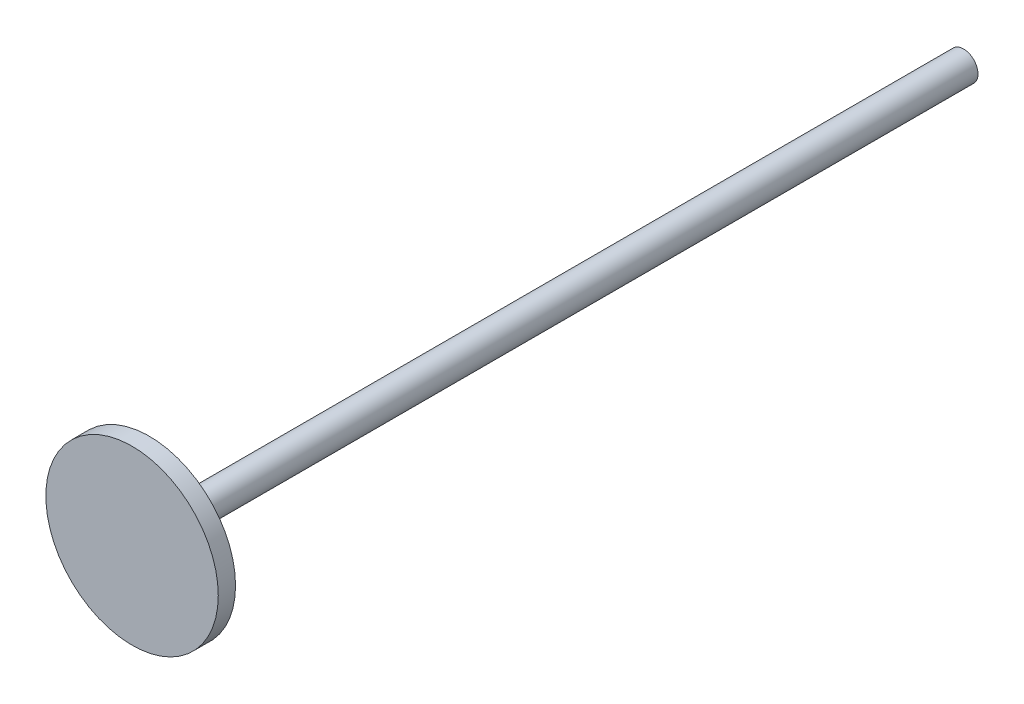
ISO-10303-21;
HEADER;
FILE_DESCRIPTION(('STEP AP214'),'2;1');
FILE_NAME('part.step','',(''),(''),'','','');
FILE_SCHEMA(('AUTOMOTIVE_DESIGN { 1 0 10303 214 1 1 1 1 }'));
ENDSEC;
DATA;
#1=APPLICATION_CONTEXT('core data for automotive mechanical design processes');
#2=APPLICATION_PROTOCOL_DEFINITION('international standard','automotive_design',2000,#1);
#3=PRODUCT_CONTEXT('',#1,'mechanical');
#4=PRODUCT('Part','Part','',(#3));
#5=PRODUCT_RELATED_PRODUCT_CATEGORY('part','',(#4));
#6=PRODUCT_DEFINITION_FORMATION('','',#4);
#7=PRODUCT_DEFINITION_CONTEXT('part definition',#1,'design');
#8=PRODUCT_DEFINITION('design','',#6,#7);
#9=PRODUCT_DEFINITION_SHAPE('','',#8);
#10=(LENGTH_UNIT() NAMED_UNIT(*) SI_UNIT(.MILLI.,.METRE.));
#11=(NAMED_UNIT(*) PLANE_ANGLE_UNIT() SI_UNIT($,.RADIAN.));
#12=(NAMED_UNIT(*) SI_UNIT($,.STERADIAN.) SOLID_ANGLE_UNIT());
#13=UNCERTAINTY_MEASURE_WITH_UNIT(LENGTH_MEASURE(1.E-05),#10,'distance_accuracy_value','');
#14=(GEOMETRIC_REPRESENTATION_CONTEXT(3) GLOBAL_UNCERTAINTY_ASSIGNED_CONTEXT((#13)) GLOBAL_UNIT_ASSIGNED_CONTEXT((#10,
#11,#12)) REPRESENTATION_CONTEXT('',''));
#15=CARTESIAN_POINT('',(0.,0.,0.));
#16=DIRECTION('',(0.,0.,1.));
#17=DIRECTION('',(1.,0.,0.));
#18=AXIS2_PLACEMENT_3D('',#15,#16,#17);
#19=CARTESIAN_POINT('',(0.,0.,230.));
#20=DIRECTION('',(0.,0.,-1.));
#21=DIRECTION('',(-1.,0.,0.));
#22=AXIS2_PLACEMENT_3D('',#19,#20,#21);
#23=CYLINDRICAL_SURFACE('',#22,23.85);
#24=CARTESIAN_POINT('',(0.,0.,230.));
#25=DIRECTION('',(0.,0.,1.));
#26=DIRECTION('',(1.,0.,0.));
#27=AXIS2_PLACEMENT_3D('',#24,#25,#26);
#28=CIRCLE('',#27,23.85);
#29=CARTESIAN_POINT('',(23.85,0.,230.));
#30=VERTEX_POINT('',#29);
#31=EDGE_CURVE('E11',#30,#30,#28,.T.);
#32=ORIENTED_EDGE('',*,*,#31,.F.);
#33=EDGE_LOOP('',(#32));
#34=FACE_BOUND('',#33,.T.);
#35=CARTESIAN_POINT('',(0.,0.,225.224809150184));
#36=DIRECTION('',(0.,0.,-1.));
#37=DIRECTION('',(-1.,0.,0.));
#38=AXIS2_PLACEMENT_3D('',#35,#36,#37);
#39=CIRCLE('',#38,23.85);
#40=CARTESIAN_POINT('',(23.85,0.,225.224809150184));
#41=VERTEX_POINT('',#40);
#42=EDGE_CURVE('E48',#41,#41,#39,.T.);
#43=ORIENTED_EDGE('',*,*,#42,.F.);
#44=EDGE_LOOP('',(#43));
#45=FACE_BOUND('',#44,.T.);
#46=ADVANCED_FACE('F38',(#34,#45),#23,.T.);
#47=CARTESIAN_POINT('',(0.,0.,230.));
#48=DIRECTION('',(0.,0.,1.));
#49=DIRECTION('',(1.,0.,0.));
#50=AXIS2_PLACEMENT_3D('',#47,#48,#49);
#51=PLANE('',#50);
#52=ORIENTED_EDGE('',*,*,#31,.T.);
#53=EDGE_LOOP('',(#52));
#54=FACE_BOUND('',#53,.T.);
#55=ADVANCED_FACE('F63',(#54),#51,.T.);
#56=CARTESIAN_POINT('',(0.,0.,218.));
#57=DIRECTION('',(0.,0.,1.));
#58=DIRECTION('',(1.,0.,0.));
#59=AXIS2_PLACEMENT_3D('',#56,#57,#58);
#60=CONICAL_SURFACE('',#59,3.99999999999997,1.22173047639603);
#61=CARTESIAN_POINT('',(0.,0.,218.));
#62=DIRECTION('',(0.,0.,-1.));
#63=DIRECTION('',(-1.,0.,0.));
#64=AXIS2_PLACEMENT_3D('',#61,#62,#63);
#65=CIRCLE('',#64,3.99999999999997);
#66=CARTESIAN_POINT('',(3.99999999999996,0.,218.));
#67=VERTEX_POINT('',#66);
#68=EDGE_CURVE('E52',#67,#67,#65,.T.);
#69=CARTESIAN_POINT('',(23.85,0.,225.224809150184));
#70=CARTESIAN_POINT('',(23.6432291666666,0.,225.149550721536));
#71=CARTESIAN_POINT('',(23.4364583333333,0.,225.074292292889));
#72=CARTESIAN_POINT('',(23.0229166666666,0.,224.923775435593));
#73=CARTESIAN_POINT('',(22.8161458333333,0.,224.848517006945));
#74=CARTESIAN_POINT('',(22.4026041666666,0.,224.69800014965));
#75=CARTESIAN_POINT('',(22.1958333333333,0.,224.622741721002));
#76=CARTESIAN_POINT('',(21.7822916666666,0.,224.472224863707));
#77=CARTESIAN_POINT('',(21.5755208333333,0.,224.396966435059));
#78=CARTESIAN_POINT('',(21.1619791666666,0.,224.246449577763));
#79=CARTESIAN_POINT('',(20.9552083333333,0.,224.171191149116));
#80=CARTESIAN_POINT('',(20.5416666666666,0.,224.02067429182));
#81=CARTESIAN_POINT('',(20.3348958333333,0.,223.945415863172));
#82=CARTESIAN_POINT('',(19.9213541666666,0.,223.794899005877));
#83=CARTESIAN_POINT('',(19.7145833333333,0.,223.719640577229));
#84=CARTESIAN_POINT('',(19.3010416666666,0.,223.569123719934));
#85=CARTESIAN_POINT('',(19.0942708333333,0.,223.493865291286));
#86=CARTESIAN_POINT('',(18.6807291666666,0.,223.34334843399));
#87=CARTESIAN_POINT('',(18.4739583333333,0.,223.268090005343));
#88=CARTESIAN_POINT('',(18.0604166666666,0.,223.117573148047));
#89=CARTESIAN_POINT('',(17.8536458333333,0.,223.042314719399));
#90=CARTESIAN_POINT('',(17.4401041666666,0.,222.891797862104));
#91=CARTESIAN_POINT('',(17.2333333333333,0.,222.816539433456));
#92=CARTESIAN_POINT('',(16.8197916666666,0.,222.666022576161));
#93=CARTESIAN_POINT('',(16.6130208333333,0.,222.590764147513));
#94=CARTESIAN_POINT('',(16.1994791666666,0.,222.440247290217));
#95=CARTESIAN_POINT('',(15.9927083333333,0.,222.36498886157));
#96=CARTESIAN_POINT('',(15.5791666666666,0.,222.214472004274));
#97=CARTESIAN_POINT('',(15.3723958333333,0.,222.139213575626));
#98=CARTESIAN_POINT('',(14.9588541666666,0.,221.988696718331));
#99=CARTESIAN_POINT('',(14.7520833333333,0.,221.913438289683));
#100=CARTESIAN_POINT('',(14.3385416666666,0.,221.762921432388));
#101=CARTESIAN_POINT('',(14.1317708333333,0.,221.68766300374));
#102=CARTESIAN_POINT('',(13.7182291666666,0.,221.537146146444));
#103=CARTESIAN_POINT('',(13.5114583333333,0.,221.461887717797));
#104=CARTESIAN_POINT('',(13.0979166666666,0.,221.311370860501));
#105=CARTESIAN_POINT('',(12.8911458333333,0.,221.236112431853));
#106=CARTESIAN_POINT('',(12.4776041666666,0.,221.085595574558));
#107=CARTESIAN_POINT('',(12.2708333333333,0.,221.01033714591));
#108=CARTESIAN_POINT('',(11.8572916666666,0.,220.859820288615));
#109=CARTESIAN_POINT('',(11.6505208333333,0.,220.784561859967));
#110=CARTESIAN_POINT('',(11.2369791666666,0.,220.634045002671));
#111=CARTESIAN_POINT('',(11.0302083333333,0.,220.558786574024));
#112=CARTESIAN_POINT('',(10.6166666666666,0.,220.408269716728));
#113=CARTESIAN_POINT('',(10.4098958333333,0.,220.33301128808));
#114=CARTESIAN_POINT('',(9.99635416666663,0.,220.182494430785));
#115=CARTESIAN_POINT('',(9.78958333333329,0.,220.107236002137));
#116=CARTESIAN_POINT('',(9.37604166666663,0.,219.956719144842));
#117=CARTESIAN_POINT('',(9.16927083333329,0.,219.881460716194));
#118=CARTESIAN_POINT('',(8.75572916666663,0.,219.730943858898));
#119=CARTESIAN_POINT('',(8.54895833333329,0.,219.655685430251));
#120=CARTESIAN_POINT('',(8.13541666666663,0.,219.505168572955));
#121=CARTESIAN_POINT('',(7.92864583333329,0.,219.429910144307));
#122=CARTESIAN_POINT('',(7.51510416666663,0.,219.279393287012));
#123=CARTESIAN_POINT('',(7.3083333333333,0.,219.204134858364));
#124=CARTESIAN_POINT('',(6.89479166666663,0.,219.053618001069));
#125=CARTESIAN_POINT('',(6.68802083333329,0.,218.978359572421));
#126=CARTESIAN_POINT('',(6.27447916666663,0.,218.827842715125));
#127=CARTESIAN_POINT('',(6.06770833333329,0.,218.752584286478));
#128=CARTESIAN_POINT('',(5.65416666666663,0.,218.602067429182));
#129=CARTESIAN_POINT('',(5.4473958333333,0.,218.526809000534));
#130=CARTESIAN_POINT('',(5.03385416666663,0.,218.376292143239));
#131=CARTESIAN_POINT('',(4.82708333333329,0.,218.301033714591));
#132=CARTESIAN_POINT('',(4.41354166666663,0.,218.150516857296));
#133=CARTESIAN_POINT('',(4.20677083333329,0.,218.075258428648));
#134=CARTESIAN_POINT('',(3.99999999999996,0.,218.));
#135=B_SPLINE_CURVE_WITH_KNOTS('',3,(#69,#70,#71,#72,#73,#74,#75,#76,#77,#78,#79,#80,#81,#82,
#83,#84,#85,#86,#87,#88,#89,#90,#91,#92,#93,#94,#95,#96,#97,#98,#99,#100,#101,#102,#103,#104,
#105,#106,#107,#108,#109,#110,#111,#112,#113,#114,#115,#116,#117,#118,#119,#120,#121,#122,#123,
#124,#125,#126,#127,#128,#129,#130,#131,#132,#133,#134),.UNSPECIFIED.,.F.,.F.,(4,2,2,2,2,2,2,2,
2,2,2,2,2,2,2,2,2,2,2,2,2,2,2,2,2,2,2,2,2,2,2,2,4),(0.,0.660122774488974,1.32024554897794,
1.9803683234669,2.64049109795587,3.30061387244483,3.96073664693379,4.62085942142276,
5.28098219591172,5.94110497040068,6.60122774488965,7.26135051937862,7.92147329386759,
8.58159606835655,9.24171884284552,9.90184161733448,10.5619643918234,11.2220871663124,
11.8822099408014,12.5423327152903,13.2024554897793,13.8625782642683,14.5227010387572,
15.1828238132462,15.8429465877352,16.5030693622241,17.1631921367131,17.8233149112021,
18.483437685691,19.14356046018,19.8036832346689,20.4638060091579,21.1239287836469),.UNSPECIFIED.);
#136=EDGE_CURVE('BSEAM60',#41,#67,#135,.T.);
#137=ORIENTED_EDGE('',*,*,#42,.T.);
#138=ORIENTED_EDGE('',*,*,#68,.F.);
#139=ORIENTED_EDGE('',*,*,#136,.T.);
#140=ORIENTED_EDGE('',*,*,#136,.F.);
#141=EDGE_LOOP('',(#137,#139,#138,#140));
#142=FACE_BOUND('',#141,.T.);
#143=ADVANCED_FACE('F60',(#142),#60,.T.);
#144=CARTESIAN_POINT('',(0.,0.,0.));
#145=DIRECTION('',(0.,0.,1.));
#146=DIRECTION('',(1.,0.,0.));
#147=AXIS2_PLACEMENT_3D('',#144,#145,#146);
#148=PLANE('',#147);
#149=CARTESIAN_POINT('',(0.,0.,0.));
#150=DIRECTION('',(0.,0.,1.));
#151=DIRECTION('',(1.,0.,0.));
#152=AXIS2_PLACEMENT_3D('',#149,#150,#151);
#153=CIRCLE('',#152,4.);
#154=CARTESIAN_POINT('',(4.,0.,0.));
#155=VERTEX_POINT('',#154);
#156=EDGE_CURVE('E44',#155,#155,#153,.T.);
#157=ORIENTED_EDGE('',*,*,#156,.F.);
#158=EDGE_LOOP('',(#157));
#159=FACE_BOUND('',#158,.T.);
#160=ADVANCED_FACE('F62',(#159),#148,.F.);
#161=CARTESIAN_POINT('',(0.,0.,218.));
#162=DIRECTION('',(0.,0.,-1.));
#163=DIRECTION('',(-1.,0.,0.));
#164=AXIS2_PLACEMENT_3D('',#161,#162,#163);
#165=CYLINDRICAL_SURFACE('',#164,4.);
#166=ORIENTED_EDGE('',*,*,#68,.T.);
#167=EDGE_LOOP('',(#166));
#168=FACE_BOUND('',#167,.T.);
#169=ORIENTED_EDGE('',*,*,#156,.T.);
#170=EDGE_LOOP('',(#169));
#171=FACE_BOUND('',#170,.T.);
#172=ADVANCED_FACE('F58',(#168,#171),#165,.T.);
#173=CLOSED_SHELL('',(#46,#55,#143,#160,#172));
#174=MANIFOLD_SOLID_BREP('B2',#173);
#175=ADVANCED_BREP_SHAPE_REPRESENTATION('',(#18,#174),#14);
#176=SHAPE_DEFINITION_REPRESENTATION(#9,#175);
ENDSEC;
END-ISO-10303-21;
